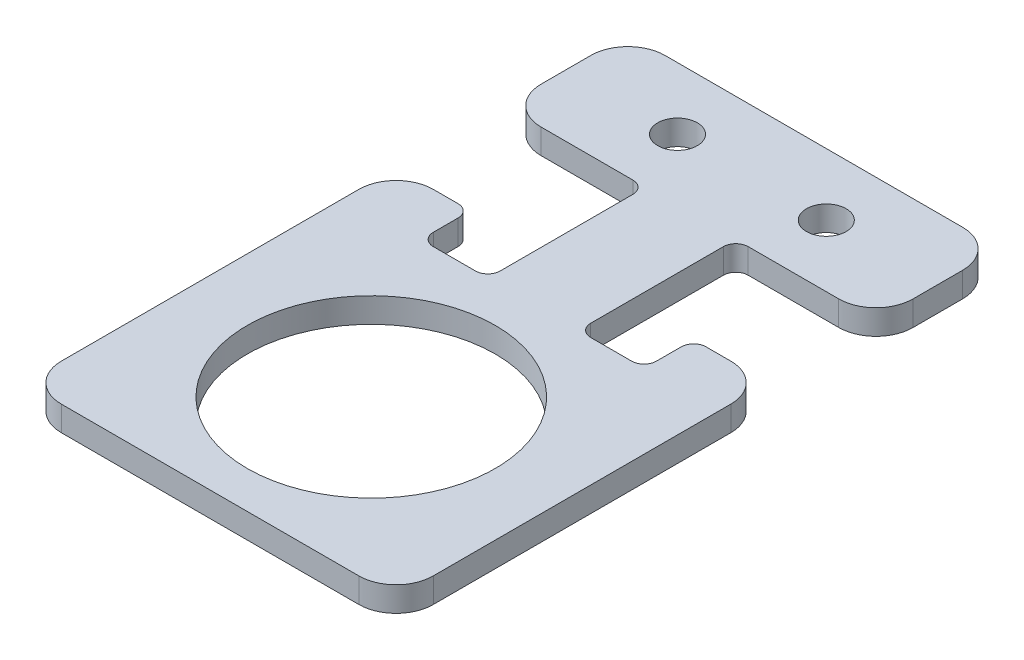
ISO-10303-21;
HEADER;
FILE_DESCRIPTION(('STEP AP214'),'2;1');
FILE_NAME('part.step','',(''),(''),'','','');
FILE_SCHEMA(('AUTOMOTIVE_DESIGN { 1 0 10303 214 1 1 1 1 }'));
ENDSEC;
DATA;
#1=APPLICATION_CONTEXT('core data for automotive mechanical design processes');
#2=APPLICATION_PROTOCOL_DEFINITION('international standard','automotive_design',2000,#1);
#3=PRODUCT_CONTEXT('',#1,'mechanical');
#4=PRODUCT('Part','Part','',(#3));
#5=PRODUCT_RELATED_PRODUCT_CATEGORY('part','',(#4));
#6=PRODUCT_DEFINITION_FORMATION('','',#4);
#7=PRODUCT_DEFINITION_CONTEXT('part definition',#1,'design');
#8=PRODUCT_DEFINITION('design','',#6,#7);
#9=PRODUCT_DEFINITION_SHAPE('','',#8);
#10=(LENGTH_UNIT() NAMED_UNIT(*) SI_UNIT(.MILLI.,.METRE.));
#11=(NAMED_UNIT(*) PLANE_ANGLE_UNIT() SI_UNIT($,.RADIAN.));
#12=(NAMED_UNIT(*) SI_UNIT($,.STERADIAN.) SOLID_ANGLE_UNIT());
#13=UNCERTAINTY_MEASURE_WITH_UNIT(LENGTH_MEASURE(1.E-05),#10,'distance_accuracy_value','');
#14=(GEOMETRIC_REPRESENTATION_CONTEXT(3) GLOBAL_UNCERTAINTY_ASSIGNED_CONTEXT((#13)) GLOBAL_UNIT_ASSIGNED_CONTEXT((#10,
#11,#12)) REPRESENTATION_CONTEXT('',''));
#15=CARTESIAN_POINT('',(0.,0.,0.));
#16=DIRECTION('',(0.,0.,1.));
#17=DIRECTION('',(1.,0.,0.));
#18=AXIS2_PLACEMENT_3D('',#15,#16,#17);
#19=CARTESIAN_POINT('',(15.,-2.,15.));
#20=DIRECTION('',(1.,0.,0.));
#21=DIRECTION('',(0.,0.,-1.));
#22=AXIS2_PLACEMENT_3D('',#19,#20,#21);
#23=PLANE('',#22);
#24=DIRECTION('',(0.,0.,-1.));
#25=VECTOR('',#24,1.);
#26=CARTESIAN_POINT('',(15.,-2.,15.));
#27=LINE('',#26,#25);
#28=CARTESIAN_POINT('',(15.,-2.,12.));
#29=VERTEX_POINT('',#28);
#30=CARTESIAN_POINT('',(15.,-2.,-12.));
#31=VERTEX_POINT('',#30);
#32=EDGE_CURVE('E446',#29,#31,#27,.T.);
#33=ORIENTED_EDGE('',*,*,#32,.T.);
#34=DIRECTION('',(0.,1.,0.));
#35=VECTOR('',#34,1.);
#36=CARTESIAN_POINT('',(15.,-2.,-12.));
#37=LINE('',#36,#35);
#38=CARTESIAN_POINT('',(15.,0.,-12.));
#39=VERTEX_POINT('',#38);
#40=EDGE_CURVE('E337',#31,#39,#37,.T.);
#41=ORIENTED_EDGE('',*,*,#40,.T.);
#42=DIRECTION('',(0.,0.,-1.));
#43=VECTOR('',#42,1.);
#44=CARTESIAN_POINT('',(15.,0.,15.));
#45=LINE('',#44,#43);
#46=CARTESIAN_POINT('',(15.,0.,12.));
#47=VERTEX_POINT('',#46);
#48=EDGE_CURVE('E478',#47,#39,#45,.T.);
#49=ORIENTED_EDGE('',*,*,#48,.F.);
#50=DIRECTION('',(0.,1.,0.));
#51=VECTOR('',#50,1.);
#52=CARTESIAN_POINT('',(15.,-2.,12.));
#53=LINE('',#52,#51);
#54=EDGE_CURVE('E335',#47,#29,#53,.F.);
#55=ORIENTED_EDGE('',*,*,#54,.T.);
#56=EDGE_LOOP('',(#33,#41,#49,#55));
#57=FACE_BOUND('',#56,.T.);
#58=ADVANCED_FACE('F46',(#57),#23,.T.);
#59=CARTESIAN_POINT('',(-15.,-2.,15.));
#60=DIRECTION('',(0.,0.,1.));
#61=DIRECTION('',(1.,0.,0.));
#62=AXIS2_PLACEMENT_3D('',#59,#60,#61);
#63=PLANE('',#62);
#64=DIRECTION('',(1.,0.,0.));
#65=VECTOR('',#64,1.);
#66=CARTESIAN_POINT('',(-15.,-2.,15.));
#67=LINE('',#66,#65);
#68=CARTESIAN_POINT('',(-12.,-2.,15.));
#69=VERTEX_POINT('',#68);
#70=CARTESIAN_POINT('',(12.,-2.,15.));
#71=VERTEX_POINT('',#70);
#72=EDGE_CURVE('E282',#69,#71,#67,.T.);
#73=ORIENTED_EDGE('',*,*,#72,.T.);
#74=DIRECTION('',(0.,1.,0.));
#75=VECTOR('',#74,1.);
#76=CARTESIAN_POINT('',(12.,-2.,15.));
#77=LINE('',#76,#75);
#78=CARTESIAN_POINT('',(12.,0.,15.));
#79=VERTEX_POINT('',#78);
#80=EDGE_CURVE('E344',#71,#79,#77,.T.);
#81=ORIENTED_EDGE('',*,*,#80,.T.);
#82=DIRECTION('',(1.,0.,0.));
#83=VECTOR('',#82,1.);
#84=CARTESIAN_POINT('',(-15.,0.,15.));
#85=LINE('',#84,#83);
#86=CARTESIAN_POINT('',(-12.,0.,15.));
#87=VERTEX_POINT('',#86);
#88=EDGE_CURVE('E290',#87,#79,#85,.T.);
#89=ORIENTED_EDGE('',*,*,#88,.F.);
#90=DIRECTION('',(0.,1.,0.));
#91=VECTOR('',#90,1.);
#92=CARTESIAN_POINT('',(-12.,-2.,15.));
#93=LINE('',#92,#91);
#94=EDGE_CURVE('E342',#87,#69,#93,.F.);
#95=ORIENTED_EDGE('',*,*,#94,.T.);
#96=EDGE_LOOP('',(#73,#81,#89,#95));
#97=FACE_BOUND('',#96,.T.);
#98=ADVANCED_FACE('F613',(#97),#63,.T.);
#99=CARTESIAN_POINT('',(-15.,-2.,15.));
#100=DIRECTION('',(-1.,0.,0.));
#101=DIRECTION('',(0.,0.,1.));
#102=AXIS2_PLACEMENT_3D('',#99,#100,#101);
#103=PLANE('',#102);
#104=DIRECTION('',(0.,0.,1.));
#105=VECTOR('',#104,1.);
#106=CARTESIAN_POINT('',(-15.,-2.,15.));
#107=LINE('',#106,#105);
#108=CARTESIAN_POINT('',(-15.,-2.,-12.));
#109=VERTEX_POINT('',#108);
#110=CARTESIAN_POINT('',(-15.,-2.,12.));
#111=VERTEX_POINT('',#110);
#112=EDGE_CURVE('E287',#109,#111,#107,.T.);
#113=ORIENTED_EDGE('',*,*,#112,.T.);
#114=DIRECTION('',(0.,1.,0.));
#115=VECTOR('',#114,1.);
#116=CARTESIAN_POINT('',(-15.,-2.,12.));
#117=LINE('',#116,#115);
#118=CARTESIAN_POINT('',(-15.,0.,12.));
#119=VERTEX_POINT('',#118);
#120=EDGE_CURVE('E349',#111,#119,#117,.T.);
#121=ORIENTED_EDGE('',*,*,#120,.T.);
#122=DIRECTION('',(0.,0.,1.));
#123=VECTOR('',#122,1.);
#124=CARTESIAN_POINT('',(-15.,0.,15.));
#125=LINE('',#124,#123);
#126=CARTESIAN_POINT('',(-15.,0.,-12.));
#127=VERTEX_POINT('',#126);
#128=EDGE_CURVE('E505',#127,#119,#125,.T.);
#129=ORIENTED_EDGE('',*,*,#128,.F.);
#130=DIRECTION('',(0.,1.,0.));
#131=VECTOR('',#130,1.);
#132=CARTESIAN_POINT('',(-15.,-2.,-12.));
#133=LINE('',#132,#131);
#134=EDGE_CURVE('E347',#127,#109,#133,.F.);
#135=ORIENTED_EDGE('',*,*,#134,.T.);
#136=EDGE_LOOP('',(#113,#121,#129,#135));
#137=FACE_BOUND('',#136,.T.);
#138=ADVANCED_FACE('F617',(#137),#103,.T.);
#139=CARTESIAN_POINT('',(-15.,-2.,-15.));
#140=DIRECTION('',(0.,0.,-1.));
#141=DIRECTION('',(-1.,0.,0.));
#142=AXIS2_PLACEMENT_3D('',#139,#140,#141);
#143=PLANE('',#142);
#144=DIRECTION('',(-1.,0.,0.));
#145=VECTOR('',#144,1.);
#146=CARTESIAN_POINT('',(-15.,0.,-15.));
#147=LINE('',#146,#145);
#148=CARTESIAN_POINT('',(-10.,0.,-15.));
#149=VERTEX_POINT('',#148);
#150=CARTESIAN_POINT('',(-12.,0.,-15.));
#151=VERTEX_POINT('',#150);
#152=EDGE_CURVE('E504',#149,#151,#147,.T.);
#153=ORIENTED_EDGE('',*,*,#152,.F.);
#154=DIRECTION('',(0.,1.,0.));
#155=VECTOR('',#154,1.);
#156=CARTESIAN_POINT('',(-10.,-2.,-15.));
#157=LINE('',#156,#155);
#158=CARTESIAN_POINT('',(-10.,-2.,-15.));
#159=VERTEX_POINT('',#158);
#160=EDGE_CURVE('E374',#149,#159,#157,.F.);
#161=ORIENTED_EDGE('',*,*,#160,.T.);
#162=DIRECTION('',(-1.,0.,0.));
#163=VECTOR('',#162,1.);
#164=CARTESIAN_POINT('',(-15.,-2.,-15.));
#165=LINE('',#164,#163);
#166=CARTESIAN_POINT('',(-12.,-2.,-15.));
#167=VERTEX_POINT('',#166);
#168=EDGE_CURVE('E474',#159,#167,#165,.T.);
#169=ORIENTED_EDGE('',*,*,#168,.T.);
#170=DIRECTION('',(0.,1.,0.));
#171=VECTOR('',#170,1.);
#172=CARTESIAN_POINT('',(-12.,-2.,-15.));
#173=LINE('',#172,#171);
#174=EDGE_CURVE('E352',#167,#151,#173,.T.);
#175=ORIENTED_EDGE('',*,*,#174,.T.);
#176=EDGE_LOOP('',(#153,#161,#169,#175));
#177=FACE_BOUND('',#176,.T.);
#178=ADVANCED_FACE('F654',(#177),#143,.T.);
#179=CARTESIAN_POINT('',(-9.,-2.,-15.));
#180=DIRECTION('',(1.,0.,0.));
#181=DIRECTION('',(0.,0.,-1.));
#182=AXIS2_PLACEMENT_3D('',#179,#180,#181);
#183=PLANE('',#182);
#184=DIRECTION('',(0.,0.,-1.));
#185=VECTOR('',#184,1.);
#186=CARTESIAN_POINT('',(-9.,0.,-15.));
#187=LINE('',#186,#185);
#188=CARTESIAN_POINT('',(-9.,0.,-12.));
#189=VERTEX_POINT('',#188);
#190=CARTESIAN_POINT('',(-9.,0.,-14.));
#191=VERTEX_POINT('',#190);
#192=EDGE_CURVE('E502',#189,#191,#187,.T.);
#193=ORIENTED_EDGE('',*,*,#192,.F.);
#194=DIRECTION('',(0.,1.,0.));
#195=VECTOR('',#194,1.);
#196=CARTESIAN_POINT('',(-9.,-2.,-12.));
#197=LINE('',#196,#195);
#198=CARTESIAN_POINT('',(-9.,-2.,-12.));
#199=VERTEX_POINT('',#198);
#200=EDGE_CURVE('E368',#189,#199,#197,.F.);
#201=ORIENTED_EDGE('',*,*,#200,.T.);
#202=DIRECTION('',(0.,0.,-1.));
#203=VECTOR('',#202,1.);
#204=CARTESIAN_POINT('',(-9.,-2.,-15.));
#205=LINE('',#204,#203);
#206=CARTESIAN_POINT('',(-9.,-2.,-14.));
#207=VERTEX_POINT('',#206);
#208=EDGE_CURVE('E471',#199,#207,#205,.T.);
#209=ORIENTED_EDGE('',*,*,#208,.T.);
#210=DIRECTION('',(0.,1.,0.));
#211=VECTOR('',#210,1.);
#212=CARTESIAN_POINT('',(-9.,-2.,-14.));
#213=LINE('',#212,#211);
#214=EDGE_CURVE('E365',#207,#191,#213,.T.);
#215=ORIENTED_EDGE('',*,*,#214,.T.);
#216=EDGE_LOOP('',(#193,#201,#209,#215));
#217=FACE_BOUND('',#216,.T.);
#218=ADVANCED_FACE('F568',(#217),#183,.T.);
#219=CARTESIAN_POINT('',(-9.,-2.,-11.));
#220=DIRECTION('',(0.,0.,-1.));
#221=DIRECTION('',(-1.,0.,0.));
#222=AXIS2_PLACEMENT_3D('',#219,#220,#221);
#223=PLANE('',#222);
#224=DIRECTION('',(-1.,0.,0.));
#225=VECTOR('',#224,1.);
#226=CARTESIAN_POINT('',(-9.,0.,-11.));
#227=LINE('',#226,#225);
#228=CARTESIAN_POINT('',(-4.6,0.,-11.));
#229=VERTEX_POINT('',#228);
#230=CARTESIAN_POINT('',(-8.,0.,-11.));
#231=VERTEX_POINT('',#230);
#232=EDGE_CURVE('E499',#229,#231,#227,.T.);
#233=ORIENTED_EDGE('',*,*,#232,.F.);
#234=DIRECTION('',(0.,1.,0.));
#235=VECTOR('',#234,1.);
#236=CARTESIAN_POINT('',(-4.6,-2.,-11.));
#237=LINE('',#236,#235);
#238=CARTESIAN_POINT('',(-4.6,-2.,-11.));
#239=VERTEX_POINT('',#238);
#240=EDGE_CURVE('E363',#229,#239,#237,.F.);
#241=ORIENTED_EDGE('',*,*,#240,.T.);
#242=DIRECTION('',(-1.,0.,0.));
#243=VECTOR('',#242,1.);
#244=CARTESIAN_POINT('',(-9.,-2.,-11.));
#245=LINE('',#244,#243);
#246=CARTESIAN_POINT('',(-8.,-2.,-11.));
#247=VERTEX_POINT('',#246);
#248=EDGE_CURVE('E468',#239,#247,#245,.T.);
#249=ORIENTED_EDGE('',*,*,#248,.T.);
#250=DIRECTION('',(0.,1.,0.));
#251=VECTOR('',#250,1.);
#252=CARTESIAN_POINT('',(-8.,0.,-11.));
#253=LINE('',#252,#251);
#254=EDGE_CURVE('E360',#247,#231,#253,.T.);
#255=ORIENTED_EDGE('',*,*,#254,.T.);
#256=EDGE_LOOP('',(#233,#241,#249,#255));
#257=FACE_BOUND('',#256,.T.);
#258=ADVANCED_FACE('F577',(#257),#223,.T.);
#259=CARTESIAN_POINT('',(-3.6,-2.,-11.));
#260=DIRECTION('',(-1.,0.,0.));
#261=DIRECTION('',(0.,0.,1.));
#262=AXIS2_PLACEMENT_3D('',#259,#260,#261);
#263=PLANE('',#262);
#264=DIRECTION('',(0.,0.,1.));
#265=VECTOR('',#264,1.);
#266=CARTESIAN_POINT('',(-3.6,-2.,-15.));
#267=LINE('',#266,#265);
#268=CARTESIAN_POINT('',(-3.6,-2.,-22.7));
#269=VERTEX_POINT('',#268);
#270=CARTESIAN_POINT('',(-3.6,-2.,-12.));
#271=VERTEX_POINT('',#270);
#272=EDGE_CURVE('E465',#269,#271,#267,.T.);
#273=ORIENTED_EDGE('',*,*,#272,.T.);
#274=DIRECTION('',(0.,1.,0.));
#275=VECTOR('',#274,1.);
#276=CARTESIAN_POINT('',(-3.6,0.,-12.));
#277=LINE('',#276,#275);
#278=CARTESIAN_POINT('',(-3.6,0.,-12.));
#279=VERTEX_POINT('',#278);
#280=EDGE_CURVE('E357',#271,#279,#277,.T.);
#281=ORIENTED_EDGE('',*,*,#280,.T.);
#282=DIRECTION('',(0.,0.,1.));
#283=VECTOR('',#282,1.);
#284=CARTESIAN_POINT('',(-3.6,0.,-11.));
#285=LINE('',#284,#283);
#286=CARTESIAN_POINT('',(-3.6,0.,-22.7));
#287=VERTEX_POINT('',#286);
#288=EDGE_CURVE('E496',#287,#279,#285,.T.);
#289=ORIENTED_EDGE('',*,*,#288,.F.);
#290=DIRECTION('',(0.,1.,0.));
#291=VECTOR('',#290,1.);
#292=CARTESIAN_POINT('',(-3.6,-2.,-22.7));
#293=LINE('',#292,#291);
#294=EDGE_CURVE('E355',#287,#269,#293,.F.);
#295=ORIENTED_EDGE('',*,*,#294,.T.);
#296=EDGE_LOOP('',(#273,#281,#289,#295));
#297=FACE_BOUND('',#296,.T.);
#298=ADVANCED_FACE('F587',(#297),#263,.T.);
#299=CARTESIAN_POINT('',(-3.6,-2.,-23.7));
#300=DIRECTION('',(0.,0.,1.));
#301=DIRECTION('',(1.,0.,0.));
#302=AXIS2_PLACEMENT_3D('',#299,#300,#301);
#303=PLANE('',#302);
#304=DIRECTION('',(1.,0.,0.));
#305=VECTOR('',#304,1.);
#306=CARTESIAN_POINT('',(-3.6,-2.,-23.7));
#307=LINE('',#306,#305);
#308=CARTESIAN_POINT('',(-12.,-2.,-23.7));
#309=VERTEX_POINT('',#308);
#310=CARTESIAN_POINT('',(-4.6,-2.,-23.7));
#311=VERTEX_POINT('',#310);
#312=EDGE_CURVE('E462',#309,#311,#307,.T.);
#313=ORIENTED_EDGE('',*,*,#312,.T.);
#314=DIRECTION('',(0.,1.,0.));
#315=VECTOR('',#314,1.);
#316=CARTESIAN_POINT('',(-4.6,0.,-23.7));
#317=LINE('',#316,#315);
#318=CARTESIAN_POINT('',(-4.6,0.,-23.7));
#319=VERTEX_POINT('',#318);
#320=EDGE_CURVE('E379',#311,#319,#317,.T.);
#321=ORIENTED_EDGE('',*,*,#320,.T.);
#322=DIRECTION('',(1.,0.,0.));
#323=VECTOR('',#322,1.);
#324=CARTESIAN_POINT('',(-3.6,0.,-23.7));
#325=LINE('',#324,#323);
#326=CARTESIAN_POINT('',(-12.,0.,-23.7));
#327=VERTEX_POINT('',#326);
#328=EDGE_CURVE('E277',#327,#319,#325,.T.);
#329=ORIENTED_EDGE('',*,*,#328,.F.);
#330=DIRECTION('',(0.,1.,0.));
#331=VECTOR('',#330,1.);
#332=CARTESIAN_POINT('',(-12.,-2.,-23.7));
#333=LINE('',#332,#331);
#334=EDGE_CURVE('E304',#327,#309,#333,.F.);
#335=ORIENTED_EDGE('',*,*,#334,.T.);
#336=EDGE_LOOP('',(#313,#321,#329,#335));
#337=FACE_BOUND('',#336,.T.);
#338=ADVANCED_FACE('F595',(#337),#303,.T.);
#339=CARTESIAN_POINT('',(-15.,-2.,-33.7));
#340=DIRECTION('',(-1.,0.,0.));
#341=DIRECTION('',(0.,0.,1.));
#342=AXIS2_PLACEMENT_3D('',#339,#340,#341);
#343=PLANE('',#342);
#344=DIRECTION('',(0.,0.,1.));
#345=VECTOR('',#344,1.);
#346=CARTESIAN_POINT('',(-15.,-2.,-33.7));
#347=LINE('',#346,#345);
#348=CARTESIAN_POINT('',(-15.,-2.,-30.7));
#349=VERTEX_POINT('',#348);
#350=CARTESIAN_POINT('',(-15.,-2.,-26.7));
#351=VERTEX_POINT('',#350);
#352=EDGE_CURVE('E460',#349,#351,#347,.T.);
#353=ORIENTED_EDGE('',*,*,#352,.T.);
#354=DIRECTION('',(0.,1.,0.));
#355=VECTOR('',#354,1.);
#356=CARTESIAN_POINT('',(-15.,-2.,-26.7));
#357=LINE('',#356,#355);
#358=CARTESIAN_POINT('',(-15.,0.,-26.7));
#359=VERTEX_POINT('',#358);
#360=EDGE_CURVE('E276',#351,#359,#357,.T.);
#361=ORIENTED_EDGE('',*,*,#360,.T.);
#362=DIRECTION('',(0.,0.,1.));
#363=VECTOR('',#362,1.);
#364=CARTESIAN_POINT('',(-15.,0.,-33.7));
#365=LINE('',#364,#363);
#366=CARTESIAN_POINT('',(-15.,0.,-30.7));
#367=VERTEX_POINT('',#366);
#368=EDGE_CURVE('E259',#367,#359,#365,.T.);
#369=ORIENTED_EDGE('',*,*,#368,.F.);
#370=DIRECTION('',(0.,1.,0.));
#371=VECTOR('',#370,1.);
#372=CARTESIAN_POINT('',(-15.,-2.,-30.7));
#373=LINE('',#372,#371);
#374=EDGE_CURVE('E273',#367,#349,#373,.F.);
#375=ORIENTED_EDGE('',*,*,#374,.T.);
#376=EDGE_LOOP('',(#353,#361,#369,#375));
#377=FACE_BOUND('',#376,.T.);
#378=ADVANCED_FACE('F272',(#377),#343,.T.);
#379=CARTESIAN_POINT('',(15.,-2.,-33.7));
#380=DIRECTION('',(0.,0.,-1.));
#381=DIRECTION('',(-1.,0.,0.));
#382=AXIS2_PLACEMENT_3D('',#379,#380,#381);
#383=PLANE('',#382);
#384=DIRECTION('',(-1.,0.,0.));
#385=VECTOR('',#384,1.);
#386=CARTESIAN_POINT('',(15.,-2.,-33.7));
#387=LINE('',#386,#385);
#388=CARTESIAN_POINT('',(12.,-2.,-33.7));
#389=VERTEX_POINT('',#388);
#390=CARTESIAN_POINT('',(-12.,-2.,-33.7));
#391=VERTEX_POINT('',#390);
#392=EDGE_CURVE('E457',#389,#391,#387,.T.);
#393=ORIENTED_EDGE('',*,*,#392,.T.);
#394=DIRECTION('',(0.,1.,0.));
#395=VECTOR('',#394,1.);
#396=CARTESIAN_POINT('',(-12.,-2.,-33.7));
#397=LINE('',#396,#395);
#398=CARTESIAN_POINT('',(-12.,0.,-33.7));
#399=VERTEX_POINT('',#398);
#400=EDGE_CURVE('E325',#391,#399,#397,.T.);
#401=ORIENTED_EDGE('',*,*,#400,.T.);
#402=DIRECTION('',(-1.,0.,0.));
#403=VECTOR('',#402,1.);
#404=CARTESIAN_POINT('',(15.,0.,-33.7));
#405=LINE('',#404,#403);
#406=CARTESIAN_POINT('',(12.,0.,-33.7));
#407=VERTEX_POINT('',#406);
#408=EDGE_CURVE('E261',#407,#399,#405,.T.);
#409=ORIENTED_EDGE('',*,*,#408,.F.);
#410=DIRECTION('',(0.,1.,0.));
#411=VECTOR('',#410,1.);
#412=CARTESIAN_POINT('',(12.,-2.,-33.7));
#413=LINE('',#412,#411);
#414=EDGE_CURVE('E323',#407,#389,#413,.F.);
#415=ORIENTED_EDGE('',*,*,#414,.T.);
#416=EDGE_LOOP('',(#393,#401,#409,#415));
#417=FACE_BOUND('',#416,.T.);
#418=ADVANCED_FACE('F639',(#417),#383,.T.);
#419=CARTESIAN_POINT('',(15.,-2.,-23.7));
#420=DIRECTION('',(1.,0.,0.));
#421=DIRECTION('',(0.,0.,-1.));
#422=AXIS2_PLACEMENT_3D('',#419,#420,#421);
#423=PLANE('',#422);
#424=DIRECTION('',(0.,0.,-1.));
#425=VECTOR('',#424,1.);
#426=CARTESIAN_POINT('',(15.,-2.,-23.7));
#427=LINE('',#426,#425);
#428=CARTESIAN_POINT('',(15.,-2.,-26.7));
#429=VERTEX_POINT('',#428);
#430=CARTESIAN_POINT('',(15.,-2.,-30.7));
#431=VERTEX_POINT('',#430);
#432=EDGE_CURVE('E454',#429,#431,#427,.T.);
#433=ORIENTED_EDGE('',*,*,#432,.T.);
#434=DIRECTION('',(0.,1.,0.));
#435=VECTOR('',#434,1.);
#436=CARTESIAN_POINT('',(15.,-2.,-30.7));
#437=LINE('',#436,#435);
#438=CARTESIAN_POINT('',(15.,0.,-30.7));
#439=VERTEX_POINT('',#438);
#440=EDGE_CURVE('E329',#431,#439,#437,.T.);
#441=ORIENTED_EDGE('',*,*,#440,.T.);
#442=DIRECTION('',(0.,0.,-1.));
#443=VECTOR('',#442,1.);
#444=CARTESIAN_POINT('',(15.,0.,-23.7));
#445=LINE('',#444,#443);
#446=CARTESIAN_POINT('',(15.,0.,-26.7));
#447=VERTEX_POINT('',#446);
#448=EDGE_CURVE('E490',#447,#439,#445,.T.);
#449=ORIENTED_EDGE('',*,*,#448,.F.);
#450=DIRECTION('',(0.,1.,0.));
#451=VECTOR('',#450,1.);
#452=CARTESIAN_POINT('',(15.,-2.,-26.7));
#453=LINE('',#452,#451);
#454=EDGE_CURVE('E327',#447,#429,#453,.F.);
#455=ORIENTED_EDGE('',*,*,#454,.T.);
#456=EDGE_LOOP('',(#433,#441,#449,#455));
#457=FACE_BOUND('',#456,.T.);
#458=ADVANCED_FACE('F635',(#457),#423,.T.);
#459=CARTESIAN_POINT('',(3.7,-2.,-23.7));
#460=DIRECTION('',(0.,0.,1.));
#461=DIRECTION('',(1.,0.,0.));
#462=AXIS2_PLACEMENT_3D('',#459,#460,#461);
#463=PLANE('',#462);
#464=DIRECTION('',(1.,0.,0.));
#465=VECTOR('',#464,1.);
#466=CARTESIAN_POINT('',(3.7,0.,-23.7));
#467=LINE('',#466,#465);
#468=CARTESIAN_POINT('',(4.7,0.,-23.7));
#469=VERTEX_POINT('',#468);
#470=CARTESIAN_POINT('',(12.,0.,-23.7));
#471=VERTEX_POINT('',#470);
#472=EDGE_CURVE('E488',#469,#471,#467,.T.);
#473=ORIENTED_EDGE('',*,*,#472,.F.);
#474=DIRECTION('',(0.,1.,0.));
#475=VECTOR('',#474,1.);
#476=CARTESIAN_POINT('',(4.7,-2.,-23.7));
#477=LINE('',#476,#475);
#478=CARTESIAN_POINT('',(4.7,-2.,-23.7));
#479=VERTEX_POINT('',#478);
#480=EDGE_CURVE('E387',#469,#479,#477,.F.);
#481=ORIENTED_EDGE('',*,*,#480,.T.);
#482=DIRECTION('',(1.,0.,0.));
#483=VECTOR('',#482,1.);
#484=CARTESIAN_POINT('',(3.7,-2.,-23.7));
#485=LINE('',#484,#483);
#486=CARTESIAN_POINT('',(12.,-2.,-23.7));
#487=VERTEX_POINT('',#486);
#488=EDGE_CURVE('E452',#479,#487,#485,.T.);
#489=ORIENTED_EDGE('',*,*,#488,.T.);
#490=DIRECTION('',(0.,1.,0.));
#491=VECTOR('',#490,1.);
#492=CARTESIAN_POINT('',(12.,-2.,-23.7));
#493=LINE('',#492,#491);
#494=EDGE_CURVE('E332',#487,#471,#493,.T.);
#495=ORIENTED_EDGE('',*,*,#494,.T.);
#496=EDGE_LOOP('',(#473,#481,#489,#495));
#497=FACE_BOUND('',#496,.T.);
#498=ADVANCED_FACE('F631',(#497),#463,.T.);
#499=CARTESIAN_POINT('',(3.7,-2.,-15.));
#500=DIRECTION('',(1.,0.,0.));
#501=DIRECTION('',(0.,0.,-1.));
#502=AXIS2_PLACEMENT_3D('',#499,#500,#501);
#503=PLANE('',#502);
#504=DIRECTION('',(0.,0.,-1.));
#505=VECTOR('',#504,1.);
#506=CARTESIAN_POINT('',(3.7,-2.,-11.));
#507=LINE('',#506,#505);
#508=CARTESIAN_POINT('',(3.7,-2.,-12.));
#509=VERTEX_POINT('',#508);
#510=CARTESIAN_POINT('',(3.7,-2.,-22.7));
#511=VERTEX_POINT('',#510);
#512=EDGE_CURVE('E444',#509,#511,#507,.T.);
#513=ORIENTED_EDGE('',*,*,#512,.T.);
#514=DIRECTION('',(0.,1.,0.));
#515=VECTOR('',#514,1.);
#516=CARTESIAN_POINT('',(3.7,0.,-22.7));
#517=LINE('',#516,#515);
#518=CARTESIAN_POINT('',(3.7,0.,-22.7));
#519=VERTEX_POINT('',#518);
#520=EDGE_CURVE('E384',#511,#519,#517,.T.);
#521=ORIENTED_EDGE('',*,*,#520,.T.);
#522=DIRECTION('',(0.,0.,-1.));
#523=VECTOR('',#522,1.);
#524=CARTESIAN_POINT('',(3.7,0.,-15.));
#525=LINE('',#524,#523);
#526=CARTESIAN_POINT('',(3.7,0.,-12.));
#527=VERTEX_POINT('',#526);
#528=EDGE_CURVE('E434',#527,#519,#525,.T.);
#529=ORIENTED_EDGE('',*,*,#528,.F.);
#530=DIRECTION('',(0.,1.,0.));
#531=VECTOR('',#530,1.);
#532=CARTESIAN_POINT('',(3.7,-2.,-12.));
#533=LINE('',#532,#531);
#534=EDGE_CURVE('E382',#527,#509,#533,.F.);
#535=ORIENTED_EDGE('',*,*,#534,.T.);
#536=EDGE_LOOP('',(#513,#521,#529,#535));
#537=FACE_BOUND('',#536,.T.);
#538=ADVANCED_FACE('F628',(#537),#503,.T.);
#539=CARTESIAN_POINT('',(9.,-2.,-11.));
#540=DIRECTION('',(0.,0.,-1.));
#541=DIRECTION('',(-1.,0.,0.));
#542=AXIS2_PLACEMENT_3D('',#539,#540,#541);
#543=PLANE('',#542);
#544=DIRECTION('',(-1.,0.,0.));
#545=VECTOR('',#544,1.);
#546=CARTESIAN_POINT('',(9.,-2.,-11.));
#547=LINE('',#546,#545);
#548=CARTESIAN_POINT('',(8.,-2.,-11.));
#549=VERTEX_POINT('',#548);
#550=CARTESIAN_POINT('',(4.7,-2.,-11.));
#551=VERTEX_POINT('',#550);
#552=EDGE_CURVE('E441',#549,#551,#547,.T.);
#553=ORIENTED_EDGE('',*,*,#552,.T.);
#554=DIRECTION('',(0.,1.,0.));
#555=VECTOR('',#554,1.);
#556=CARTESIAN_POINT('',(4.7,0.,-11.));
#557=LINE('',#556,#555);
#558=CARTESIAN_POINT('',(4.7,0.,-11.));
#559=VERTEX_POINT('',#558);
#560=EDGE_CURVE('E391',#551,#559,#557,.T.);
#561=ORIENTED_EDGE('',*,*,#560,.T.);
#562=DIRECTION('',(-1.,0.,0.));
#563=VECTOR('',#562,1.);
#564=CARTESIAN_POINT('',(9.,0.,-11.));
#565=LINE('',#564,#563);
#566=CARTESIAN_POINT('',(8.,0.,-11.));
#567=VERTEX_POINT('',#566);
#568=EDGE_CURVE('E424',#567,#559,#565,.T.);
#569=ORIENTED_EDGE('',*,*,#568,.F.);
#570=DIRECTION('',(0.,1.,0.));
#571=VECTOR('',#570,1.);
#572=CARTESIAN_POINT('',(8.,-2.,-11.));
#573=LINE('',#572,#571);
#574=EDGE_CURVE('E389',#567,#549,#573,.F.);
#575=ORIENTED_EDGE('',*,*,#574,.T.);
#576=EDGE_LOOP('',(#553,#561,#569,#575));
#577=FACE_BOUND('',#576,.T.);
#578=ADVANCED_FACE('F432',(#577),#543,.T.);
#579=CARTESIAN_POINT('',(9.,-2.,-15.));
#580=DIRECTION('',(-1.,0.,0.));
#581=DIRECTION('',(0.,0.,1.));
#582=AXIS2_PLACEMENT_3D('',#579,#580,#581);
#583=PLANE('',#582);
#584=DIRECTION('',(0.,0.,1.));
#585=VECTOR('',#584,1.);
#586=CARTESIAN_POINT('',(9.,-2.,-15.));
#587=LINE('',#586,#585);
#588=CARTESIAN_POINT('',(9.,-2.,-14.));
#589=VERTEX_POINT('',#588);
#590=CARTESIAN_POINT('',(9.,-2.,-12.));
#591=VERTEX_POINT('',#590);
#592=EDGE_CURVE('E440',#589,#591,#587,.T.);
#593=ORIENTED_EDGE('',*,*,#592,.T.);
#594=DIRECTION('',(0.,1.,0.));
#595=VECTOR('',#594,1.);
#596=CARTESIAN_POINT('',(9.,0.,-12.));
#597=LINE('',#596,#595);
#598=CARTESIAN_POINT('',(9.,0.,-12.));
#599=VERTEX_POINT('',#598);
#600=EDGE_CURVE('E396',#591,#599,#597,.T.);
#601=ORIENTED_EDGE('',*,*,#600,.T.);
#602=DIRECTION('',(0.,0.,1.));
#603=VECTOR('',#602,1.);
#604=CARTESIAN_POINT('',(9.,0.,-15.));
#605=LINE('',#604,#603);
#606=CARTESIAN_POINT('',(9.,0.,-14.));
#607=VERTEX_POINT('',#606);
#608=EDGE_CURVE('E426',#607,#599,#605,.T.);
#609=ORIENTED_EDGE('',*,*,#608,.F.);
#610=DIRECTION('',(0.,1.,0.));
#611=VECTOR('',#610,1.);
#612=CARTESIAN_POINT('',(9.,-2.,-14.));
#613=LINE('',#612,#611);
#614=EDGE_CURVE('E394',#607,#589,#613,.F.);
#615=ORIENTED_EDGE('',*,*,#614,.T.);
#616=EDGE_LOOP('',(#593,#601,#609,#615));
#617=FACE_BOUND('',#616,.T.);
#618=ADVANCED_FACE('F438',(#617),#583,.T.);
#619=CARTESIAN_POINT('',(15.,-2.,-15.));
#620=DIRECTION('',(0.,0.,-1.));
#621=DIRECTION('',(-1.,0.,0.));
#622=AXIS2_PLACEMENT_3D('',#619,#620,#621);
#623=PLANE('',#622);
#624=DIRECTION('',(-1.,0.,0.));
#625=VECTOR('',#624,1.);
#626=CARTESIAN_POINT('',(15.,-2.,-15.));
#627=LINE('',#626,#625);
#628=CARTESIAN_POINT('',(12.,-2.,-15.));
#629=VERTEX_POINT('',#628);
#630=CARTESIAN_POINT('',(10.,-2.,-15.));
#631=VERTEX_POINT('',#630);
#632=EDGE_CURVE('E442',#629,#631,#627,.T.);
#633=ORIENTED_EDGE('',*,*,#632,.T.);
#634=DIRECTION('',(0.,1.,0.));
#635=VECTOR('',#634,1.);
#636=CARTESIAN_POINT('',(10.,-2.,-15.));
#637=LINE('',#636,#635);
#638=CARTESIAN_POINT('',(10.,0.,-15.));
#639=VERTEX_POINT('',#638);
#640=EDGE_CURVE('E399',#631,#639,#637,.T.);
#641=ORIENTED_EDGE('',*,*,#640,.T.);
#642=DIRECTION('',(-1.,0.,0.));
#643=VECTOR('',#642,1.);
#644=CARTESIAN_POINT('',(15.,0.,-15.));
#645=LINE('',#644,#643);
#646=CARTESIAN_POINT('',(12.,0.,-15.));
#647=VERTEX_POINT('',#646);
#648=EDGE_CURVE('E481',#647,#639,#645,.T.);
#649=ORIENTED_EDGE('',*,*,#648,.F.);
#650=DIRECTION('',(0.,1.,0.));
#651=VECTOR('',#650,1.);
#652=CARTESIAN_POINT('',(12.,-2.,-15.));
#653=LINE('',#652,#651);
#654=EDGE_CURVE('E340',#647,#629,#653,.F.);
#655=ORIENTED_EDGE('',*,*,#654,.T.);
#656=EDGE_LOOP('',(#633,#641,#649,#655));
#657=FACE_BOUND('',#656,.T.);
#658=ADVANCED_FACE('F552',(#657),#623,.T.);
#659=CARTESIAN_POINT('',(0.,-2.,0.));
#660=DIRECTION('',(0.,1.,0.));
#661=DIRECTION('',(0.,0.,1.));
#662=AXIS2_PLACEMENT_3D('',#659,#660,#661);
#663=PLANE('',#662);
#664=CARTESIAN_POINT('',(0.,-2.,2.));
#665=DIRECTION('',(0.,1.,0.));
#666=DIRECTION('',(0.,0.,1.));
#667=AXIS2_PLACEMENT_3D('',#664,#665,#666);
#668=CIRCLE('',#667,10.);
#669=CARTESIAN_POINT('',(0.,-2.,12.));
#670=VERTEX_POINT('',#669);
#671=EDGE_CURVE('E524',#670,#670,#668,.T.);
#672=ORIENTED_EDGE('',*,*,#671,.T.);
#673=EDGE_LOOP('',(#672));
#674=FACE_BOUND('',#673,.T.);
#675=CARTESIAN_POINT('',(-6.,-2.,-28.7));
#676=DIRECTION('',(0.,1.,0.));
#677=DIRECTION('',(0.,0.,1.));
#678=AXIS2_PLACEMENT_3D('',#675,#676,#677);
#679=CIRCLE('',#678,1.6);
#680=CARTESIAN_POINT('',(-6.,-2.,-27.1));
#681=VERTEX_POINT('',#680);
#682=EDGE_CURVE('E482',#681,#681,#679,.T.);
#683=ORIENTED_EDGE('',*,*,#682,.T.);
#684=EDGE_LOOP('',(#683));
#685=FACE_BOUND('',#684,.T.);
#686=CARTESIAN_POINT('',(6.,-2.,-28.7));
#687=DIRECTION('',(0.,1.,0.));
#688=DIRECTION('',(0.,0.,1.));
#689=AXIS2_PLACEMENT_3D('',#686,#687,#688);
#690=CIRCLE('',#689,1.6);
#691=CARTESIAN_POINT('',(6.,-2.,-27.1));
#692=VERTEX_POINT('',#691);
#693=EDGE_CURVE('E517',#692,#692,#690,.T.);
#694=ORIENTED_EDGE('',*,*,#693,.T.);
#695=EDGE_LOOP('',(#694));
#696=FACE_BOUND('',#695,.T.);
#697=ORIENTED_EDGE('',*,*,#168,.F.);
#698=CARTESIAN_POINT('',(-10.,-2.,-14.));
#699=DIRECTION('',(0.,1.,0.));
#700=DIRECTION('',(0.,0.,1.));
#701=AXIS2_PLACEMENT_3D('',#698,#699,#700);
#702=CIRCLE('',#701,1.);
#703=EDGE_CURVE('E377',#159,#207,#702,.F.);
#704=ORIENTED_EDGE('',*,*,#703,.T.);
#705=ORIENTED_EDGE('',*,*,#208,.F.);
#706=CARTESIAN_POINT('',(-8.,-2.,-12.));
#707=DIRECTION('',(0.,1.,0.));
#708=DIRECTION('',(0.,0.,1.));
#709=AXIS2_PLACEMENT_3D('',#706,#707,#708);
#710=CIRCLE('',#709,1.);
#711=EDGE_CURVE('E408',#199,#247,#710,.T.);
#712=ORIENTED_EDGE('',*,*,#711,.T.);
#713=ORIENTED_EDGE('',*,*,#248,.F.);
#714=CARTESIAN_POINT('',(-4.6,-2.,-12.));
#715=DIRECTION('',(0.,1.,0.));
#716=DIRECTION('',(0.,0.,1.));
#717=AXIS2_PLACEMENT_3D('',#714,#715,#716);
#718=CIRCLE('',#717,1.);
#719=EDGE_CURVE('E404',#239,#271,#718,.T.);
#720=ORIENTED_EDGE('',*,*,#719,.T.);
#721=ORIENTED_EDGE('',*,*,#272,.F.);
#722=CARTESIAN_POINT('',(-4.6,-2.,-22.7));
#723=DIRECTION('',(0.,1.,0.));
#724=DIRECTION('',(0.,0.,1.));
#725=AXIS2_PLACEMENT_3D('',#722,#723,#724);
#726=CIRCLE('',#725,1.);
#727=EDGE_CURVE('E412',#269,#311,#726,.T.);
#728=ORIENTED_EDGE('',*,*,#727,.T.);
#729=ORIENTED_EDGE('',*,*,#312,.F.);
#730=CARTESIAN_POINT('',(-12.,-2.,-26.7));
#731=DIRECTION('',(0.,1.,0.));
#732=DIRECTION('',(0.,0.,1.));
#733=AXIS2_PLACEMENT_3D('',#730,#731,#732);
#734=CIRCLE('',#733,3.);
#735=EDGE_CURVE('E321',#309,#351,#734,.F.);
#736=ORIENTED_EDGE('',*,*,#735,.T.);
#737=ORIENTED_EDGE('',*,*,#352,.F.);
#738=CARTESIAN_POINT('',(-12.,-2.,-30.7));
#739=DIRECTION('',(0.,1.,0.));
#740=DIRECTION('',(0.,0.,1.));
#741=AXIS2_PLACEMENT_3D('',#738,#739,#740);
#742=CIRCLE('',#741,3.);
#743=EDGE_CURVE('E281',#349,#391,#742,.F.);
#744=ORIENTED_EDGE('',*,*,#743,.T.);
#745=ORIENTED_EDGE('',*,*,#392,.F.);
#746=CARTESIAN_POINT('',(12.,-2.,-30.7));
#747=DIRECTION('',(0.,1.,0.));
#748=DIRECTION('',(0.,0.,1.));
#749=AXIS2_PLACEMENT_3D('',#746,#747,#748);
#750=CIRCLE('',#749,3.);
#751=EDGE_CURVE('E318',#389,#431,#750,.F.);
#752=ORIENTED_EDGE('',*,*,#751,.T.);
#753=ORIENTED_EDGE('',*,*,#432,.F.);
#754=CARTESIAN_POINT('',(12.,-2.,-26.7));
#755=DIRECTION('',(0.,1.,0.));
#756=DIRECTION('',(0.,0.,1.));
#757=AXIS2_PLACEMENT_3D('',#754,#755,#756);
#758=CIRCLE('',#757,3.);
#759=EDGE_CURVE('E315',#429,#487,#758,.F.);
#760=ORIENTED_EDGE('',*,*,#759,.T.);
#761=ORIENTED_EDGE('',*,*,#488,.F.);
#762=CARTESIAN_POINT('',(4.7,-2.,-22.7));
#763=DIRECTION('',(0.,1.,0.));
#764=DIRECTION('',(0.,0.,1.));
#765=AXIS2_PLACEMENT_3D('',#762,#763,#764);
#766=CIRCLE('',#765,1.);
#767=EDGE_CURVE('E416',#479,#511,#766,.T.);
#768=ORIENTED_EDGE('',*,*,#767,.T.);
#769=ORIENTED_EDGE('',*,*,#512,.F.);
#770=CARTESIAN_POINT('',(4.7,-2.,-12.));
#771=DIRECTION('',(0.,1.,0.));
#772=DIRECTION('',(0.,0.,1.));
#773=AXIS2_PLACEMENT_3D('',#770,#771,#772);
#774=CIRCLE('',#773,1.);
#775=EDGE_CURVE('E420',#509,#551,#774,.T.);
#776=ORIENTED_EDGE('',*,*,#775,.T.);
#777=ORIENTED_EDGE('',*,*,#552,.F.);
#778=CARTESIAN_POINT('',(8.,-2.,-12.));
#779=DIRECTION('',(0.,1.,0.));
#780=DIRECTION('',(0.,0.,1.));
#781=AXIS2_PLACEMENT_3D('',#778,#779,#780);
#782=CIRCLE('',#781,1.);
#783=EDGE_CURVE('E12',#549,#591,#782,.T.);
#784=ORIENTED_EDGE('',*,*,#783,.T.);
#785=ORIENTED_EDGE('',*,*,#592,.F.);
#786=CARTESIAN_POINT('',(10.,-2.,-14.));
#787=DIRECTION('',(0.,1.,0.));
#788=DIRECTION('',(0.,0.,1.));
#789=AXIS2_PLACEMENT_3D('',#786,#787,#788);
#790=CIRCLE('',#789,1.);
#791=EDGE_CURVE('E61',#589,#631,#790,.F.);
#792=ORIENTED_EDGE('',*,*,#791,.T.);
#793=ORIENTED_EDGE('',*,*,#632,.F.);
#794=CARTESIAN_POINT('',(12.,-2.,-12.));
#795=DIRECTION('',(0.,1.,0.));
#796=DIRECTION('',(0.,0.,1.));
#797=AXIS2_PLACEMENT_3D('',#794,#795,#796);
#798=CIRCLE('',#797,3.);
#799=EDGE_CURVE('E313',#629,#31,#798,.F.);
#800=ORIENTED_EDGE('',*,*,#799,.T.);
#801=ORIENTED_EDGE('',*,*,#32,.F.);
#802=CARTESIAN_POINT('',(12.,-2.,12.));
#803=DIRECTION('',(0.,1.,0.));
#804=DIRECTION('',(0.,0.,1.));
#805=AXIS2_PLACEMENT_3D('',#802,#803,#804);
#806=CIRCLE('',#805,3.);
#807=EDGE_CURVE('E311',#29,#71,#806,.F.);
#808=ORIENTED_EDGE('',*,*,#807,.T.);
#809=ORIENTED_EDGE('',*,*,#72,.F.);
#810=CARTESIAN_POINT('',(-12.,-2.,12.));
#811=DIRECTION('',(0.,1.,0.));
#812=DIRECTION('',(0.,0.,1.));
#813=AXIS2_PLACEMENT_3D('',#810,#811,#812);
#814=CIRCLE('',#813,3.);
#815=EDGE_CURVE('E309',#69,#111,#814,.F.);
#816=ORIENTED_EDGE('',*,*,#815,.T.);
#817=ORIENTED_EDGE('',*,*,#112,.F.);
#818=CARTESIAN_POINT('',(-12.,-2.,-12.));
#819=DIRECTION('',(0.,1.,0.));
#820=DIRECTION('',(0.,0.,1.));
#821=AXIS2_PLACEMENT_3D('',#818,#819,#820);
#822=CIRCLE('',#821,3.);
#823=EDGE_CURVE('E306',#109,#167,#822,.F.);
#824=ORIENTED_EDGE('',*,*,#823,.T.);
#825=EDGE_LOOP('',(#697,#704,#705,#712,#713,#720,#721,#728,#729,#736,#737,#744,#745,#752,#753,
#760,#761,#768,#769,#776,#777,#784,#785,#792,#793,#800,#801,#808,#809,#816,#817,#824));
#826=FACE_BOUND('',#825,.T.);
#827=ADVANCED_FACE('F539',(#674,#685,#696,#826),#663,.F.);
#828=CARTESIAN_POINT('',(0.,0.,0.));
#829=DIRECTION('',(0.,1.,0.));
#830=DIRECTION('',(0.,0.,1.));
#831=AXIS2_PLACEMENT_3D('',#828,#829,#830);
#832=PLANE('',#831);
#833=CARTESIAN_POINT('',(0.,0.,2.));
#834=DIRECTION('',(0.,1.,0.));
#835=DIRECTION('',(0.,0.,1.));
#836=AXIS2_PLACEMENT_3D('',#833,#834,#835);
#837=CIRCLE('',#836,10.);
#838=CARTESIAN_POINT('',(0.,0.,12.));
#839=VERTEX_POINT('',#838);
#840=EDGE_CURVE('E529',#839,#839,#837,.T.);
#841=ORIENTED_EDGE('',*,*,#840,.F.);
#842=EDGE_LOOP('',(#841));
#843=FACE_BOUND('',#842,.T.);
#844=CARTESIAN_POINT('',(-6.,0.,-28.7));
#845=DIRECTION('',(0.,1.,0.));
#846=DIRECTION('',(0.,0.,1.));
#847=AXIS2_PLACEMENT_3D('',#844,#845,#846);
#848=CIRCLE('',#847,1.6);
#849=CARTESIAN_POINT('',(-6.,0.,-27.1));
#850=VERTEX_POINT('',#849);
#851=EDGE_CURVE('E520',#850,#850,#848,.T.);
#852=ORIENTED_EDGE('',*,*,#851,.F.);
#853=EDGE_LOOP('',(#852));
#854=FACE_BOUND('',#853,.T.);
#855=CARTESIAN_POINT('',(6.,0.,-28.7));
#856=DIRECTION('',(0.,1.,0.));
#857=DIRECTION('',(0.,0.,1.));
#858=AXIS2_PLACEMENT_3D('',#855,#856,#857);
#859=CIRCLE('',#858,1.6);
#860=CARTESIAN_POINT('',(6.,0.,-27.1));
#861=VERTEX_POINT('',#860);
#862=EDGE_CURVE('E521',#861,#861,#859,.T.);
#863=ORIENTED_EDGE('',*,*,#862,.F.);
#864=EDGE_LOOP('',(#863));
#865=FACE_BOUND('',#864,.T.);
#866=ORIENTED_EDGE('',*,*,#192,.T.);
#867=CARTESIAN_POINT('',(-10.,0.,-14.));
#868=DIRECTION('',(0.,1.,0.));
#869=DIRECTION('',(0.,0.,1.));
#870=AXIS2_PLACEMENT_3D('',#867,#868,#869);
#871=CIRCLE('',#870,1.);
#872=EDGE_CURVE('E372',#191,#149,#871,.T.);
#873=ORIENTED_EDGE('',*,*,#872,.T.);
#874=ORIENTED_EDGE('',*,*,#152,.T.);
#875=CARTESIAN_POINT('',(-12.,0.,-12.));
#876=DIRECTION('',(0.,1.,0.));
#877=DIRECTION('',(0.,0.,1.));
#878=AXIS2_PLACEMENT_3D('',#875,#876,#877);
#879=CIRCLE('',#878,3.);
#880=EDGE_CURVE('E284',#151,#127,#879,.T.);
#881=ORIENTED_EDGE('',*,*,#880,.T.);
#882=ORIENTED_EDGE('',*,*,#128,.T.);
#883=CARTESIAN_POINT('',(-12.,0.,12.));
#884=DIRECTION('',(0.,1.,0.));
#885=DIRECTION('',(0.,0.,1.));
#886=AXIS2_PLACEMENT_3D('',#883,#884,#885);
#887=CIRCLE('',#886,3.);
#888=EDGE_CURVE('E294',#119,#87,#887,.T.);
#889=ORIENTED_EDGE('',*,*,#888,.T.);
#890=ORIENTED_EDGE('',*,*,#88,.T.);
#891=CARTESIAN_POINT('',(12.,0.,12.));
#892=DIRECTION('',(0.,1.,0.));
#893=DIRECTION('',(0.,0.,1.));
#894=AXIS2_PLACEMENT_3D('',#891,#892,#893);
#895=CIRCLE('',#894,3.);
#896=EDGE_CURVE('E296',#79,#47,#895,.T.);
#897=ORIENTED_EDGE('',*,*,#896,.T.);
#898=ORIENTED_EDGE('',*,*,#48,.T.);
#899=CARTESIAN_POINT('',(12.,0.,-12.));
#900=DIRECTION('',(0.,1.,0.));
#901=DIRECTION('',(0.,0.,1.));
#902=AXIS2_PLACEMENT_3D('',#899,#900,#901);
#903=CIRCLE('',#902,3.);
#904=EDGE_CURVE('E298',#39,#647,#903,.T.);
#905=ORIENTED_EDGE('',*,*,#904,.T.);
#906=ORIENTED_EDGE('',*,*,#648,.T.);
#907=CARTESIAN_POINT('',(10.,0.,-14.));
#908=DIRECTION('',(0.,1.,0.));
#909=DIRECTION('',(0.,0.,1.));
#910=AXIS2_PLACEMENT_3D('',#907,#908,#909);
#911=CIRCLE('',#910,1.);
#912=EDGE_CURVE('E370',#639,#607,#911,.T.);
#913=ORIENTED_EDGE('',*,*,#912,.T.);
#914=ORIENTED_EDGE('',*,*,#608,.T.);
#915=CARTESIAN_POINT('',(8.,0.,-12.));
#916=DIRECTION('',(0.,1.,0.));
#917=DIRECTION('',(0.,0.,1.));
#918=AXIS2_PLACEMENT_3D('',#915,#916,#917);
#919=CIRCLE('',#918,1.);
#920=EDGE_CURVE('E54',#599,#567,#919,.F.);
#921=ORIENTED_EDGE('',*,*,#920,.T.);
#922=ORIENTED_EDGE('',*,*,#568,.T.);
#923=CARTESIAN_POINT('',(4.7,0.,-12.));
#924=DIRECTION('',(0.,1.,0.));
#925=DIRECTION('',(0.,0.,1.));
#926=AXIS2_PLACEMENT_3D('',#923,#924,#925);
#927=CIRCLE('',#926,1.);
#928=EDGE_CURVE('E418',#559,#527,#927,.F.);
#929=ORIENTED_EDGE('',*,*,#928,.T.);
#930=ORIENTED_EDGE('',*,*,#528,.T.);
#931=CARTESIAN_POINT('',(4.7,0.,-22.7));
#932=DIRECTION('',(0.,1.,0.));
#933=DIRECTION('',(0.,0.,1.));
#934=AXIS2_PLACEMENT_3D('',#931,#932,#933);
#935=CIRCLE('',#934,1.);
#936=EDGE_CURVE('E414',#519,#469,#935,.F.);
#937=ORIENTED_EDGE('',*,*,#936,.T.);
#938=ORIENTED_EDGE('',*,*,#472,.T.);
#939=CARTESIAN_POINT('',(12.,0.,-26.7));
#940=DIRECTION('',(0.,1.,0.));
#941=DIRECTION('',(0.,0.,1.));
#942=AXIS2_PLACEMENT_3D('',#939,#940,#941);
#943=CIRCLE('',#942,3.);
#944=EDGE_CURVE('E300',#471,#447,#943,.T.);
#945=ORIENTED_EDGE('',*,*,#944,.T.);
#946=ORIENTED_EDGE('',*,*,#448,.T.);
#947=CARTESIAN_POINT('',(12.,0.,-30.7));
#948=DIRECTION('',(0.,1.,0.));
#949=DIRECTION('',(0.,0.,1.));
#950=AXIS2_PLACEMENT_3D('',#947,#948,#949);
#951=CIRCLE('',#950,3.);
#952=EDGE_CURVE('E267',#439,#407,#951,.T.);
#953=ORIENTED_EDGE('',*,*,#952,.T.);
#954=ORIENTED_EDGE('',*,*,#408,.T.);
#955=CARTESIAN_POINT('',(-12.,0.,-30.7));
#956=DIRECTION('',(0.,1.,0.));
#957=DIRECTION('',(0.,0.,1.));
#958=AXIS2_PLACEMENT_3D('',#955,#956,#957);
#959=CIRCLE('',#958,3.);
#960=EDGE_CURVE('E255',#399,#367,#959,.T.);
#961=ORIENTED_EDGE('',*,*,#960,.T.);
#962=ORIENTED_EDGE('',*,*,#368,.T.);
#963=CARTESIAN_POINT('',(-12.,0.,-26.7));
#964=DIRECTION('',(0.,1.,0.));
#965=DIRECTION('',(0.,0.,1.));
#966=AXIS2_PLACEMENT_3D('',#963,#964,#965);
#967=CIRCLE('',#966,3.);
#968=EDGE_CURVE('E266',#359,#327,#967,.T.);
#969=ORIENTED_EDGE('',*,*,#968,.T.);
#970=ORIENTED_EDGE('',*,*,#328,.T.);
#971=CARTESIAN_POINT('',(-4.6,0.,-22.7));
#972=DIRECTION('',(0.,1.,0.));
#973=DIRECTION('',(0.,0.,1.));
#974=AXIS2_PLACEMENT_3D('',#971,#972,#973);
#975=CIRCLE('',#974,1.);
#976=EDGE_CURVE('E410',#319,#287,#975,.F.);
#977=ORIENTED_EDGE('',*,*,#976,.T.);
#978=ORIENTED_EDGE('',*,*,#288,.T.);
#979=CARTESIAN_POINT('',(-4.6,0.,-12.));
#980=DIRECTION('',(0.,1.,0.));
#981=DIRECTION('',(0.,0.,1.));
#982=AXIS2_PLACEMENT_3D('',#979,#980,#981);
#983=CIRCLE('',#982,1.);
#984=EDGE_CURVE('E402',#279,#229,#983,.F.);
#985=ORIENTED_EDGE('',*,*,#984,.T.);
#986=ORIENTED_EDGE('',*,*,#232,.T.);
#987=CARTESIAN_POINT('',(-8.,0.,-12.));
#988=DIRECTION('',(0.,1.,0.));
#989=DIRECTION('',(0.,0.,1.));
#990=AXIS2_PLACEMENT_3D('',#987,#988,#989);
#991=CIRCLE('',#990,1.);
#992=EDGE_CURVE('E406',#231,#189,#991,.F.);
#993=ORIENTED_EDGE('',*,*,#992,.T.);
#994=EDGE_LOOP('',(#866,#873,#874,#881,#882,#889,#890,#897,#898,#905,#906,#913,#914,#921,#922,
#929,#930,#937,#938,#945,#946,#953,#954,#961,#962,#969,#970,#977,#978,#985,#986,#993));
#995=FACE_BOUND('',#994,.T.);
#996=ADVANCED_FACE('F258',(#843,#854,#865,#995),#832,.T.);
#997=CARTESIAN_POINT('',(6.,-10.,-28.7));
#998=DIRECTION('',(0.,1.,0.));
#999=DIRECTION('',(0.,0.,1.));
#1000=AXIS2_PLACEMENT_3D('',#997,#998,#999);
#1001=CYLINDRICAL_SURFACE('',#1000,1.6);
#1002=ORIENTED_EDGE('',*,*,#862,.T.);
#1003=EDGE_LOOP('',(#1002));
#1004=FACE_BOUND('',#1003,.T.);
#1005=ORIENTED_EDGE('',*,*,#693,.F.);
#1006=EDGE_LOOP('',(#1005));
#1007=FACE_BOUND('',#1006,.T.);
#1008=ADVANCED_FACE('F538',(#1004,#1007),#1001,.F.);
#1009=CARTESIAN_POINT('',(-6.,-10.,-28.7));
#1010=DIRECTION('',(0.,1.,0.));
#1011=DIRECTION('',(0.,0.,1.));
#1012=AXIS2_PLACEMENT_3D('',#1009,#1010,#1011);
#1013=CYLINDRICAL_SURFACE('',#1012,1.6);
#1014=ORIENTED_EDGE('',*,*,#851,.T.);
#1015=EDGE_LOOP('',(#1014));
#1016=FACE_BOUND('',#1015,.T.);
#1017=ORIENTED_EDGE('',*,*,#682,.F.);
#1018=EDGE_LOOP('',(#1017));
#1019=FACE_BOUND('',#1018,.T.);
#1020=ADVANCED_FACE('F547',(#1016,#1019),#1013,.F.);
#1021=CARTESIAN_POINT('',(-12.,-2.,-26.7));
#1022=DIRECTION('',(0.,1.,0.));
#1023=DIRECTION('',(0.,0.,1.));
#1024=AXIS2_PLACEMENT_3D('',#1021,#1022,#1023);
#1025=CYLINDRICAL_SURFACE('',#1024,3.);
#1026=ORIENTED_EDGE('',*,*,#735,.F.);
#1027=ORIENTED_EDGE('',*,*,#334,.F.);
#1028=ORIENTED_EDGE('',*,*,#968,.F.);
#1029=ORIENTED_EDGE('',*,*,#360,.F.);
#1030=EDGE_LOOP('',(#1026,#1027,#1028,#1029));
#1031=FACE_BOUND('',#1030,.T.);
#1032=ADVANCED_FACE('F600',(#1031),#1025,.T.);
#1033=CARTESIAN_POINT('',(-12.,-2.,-30.7));
#1034=DIRECTION('',(0.,1.,0.));
#1035=DIRECTION('',(0.,0.,1.));
#1036=AXIS2_PLACEMENT_3D('',#1033,#1034,#1035);
#1037=CYLINDRICAL_SURFACE('',#1036,3.);
#1038=ORIENTED_EDGE('',*,*,#743,.F.);
#1039=ORIENTED_EDGE('',*,*,#374,.F.);
#1040=ORIENTED_EDGE('',*,*,#960,.F.);
#1041=ORIENTED_EDGE('',*,*,#400,.F.);
#1042=EDGE_LOOP('',(#1038,#1039,#1040,#1041));
#1043=FACE_BOUND('',#1042,.T.);
#1044=ADVANCED_FACE('F280',(#1043),#1037,.T.);
#1045=CARTESIAN_POINT('',(12.,-2.,-30.7));
#1046=DIRECTION('',(0.,1.,0.));
#1047=DIRECTION('',(0.,0.,1.));
#1048=AXIS2_PLACEMENT_3D('',#1045,#1046,#1047);
#1049=CYLINDRICAL_SURFACE('',#1048,3.);
#1050=ORIENTED_EDGE('',*,*,#751,.F.);
#1051=ORIENTED_EDGE('',*,*,#414,.F.);
#1052=ORIENTED_EDGE('',*,*,#952,.F.);
#1053=ORIENTED_EDGE('',*,*,#440,.F.);
#1054=EDGE_LOOP('',(#1050,#1051,#1052,#1053));
#1055=FACE_BOUND('',#1054,.T.);
#1056=ADVANCED_FACE('F607',(#1055),#1049,.T.);
#1057=CARTESIAN_POINT('',(12.,-2.,-26.7));
#1058=DIRECTION('',(0.,1.,0.));
#1059=DIRECTION('',(0.,0.,1.));
#1060=AXIS2_PLACEMENT_3D('',#1057,#1058,#1059);
#1061=CYLINDRICAL_SURFACE('',#1060,3.);
#1062=ORIENTED_EDGE('',*,*,#759,.F.);
#1063=ORIENTED_EDGE('',*,*,#454,.F.);
#1064=ORIENTED_EDGE('',*,*,#944,.F.);
#1065=ORIENTED_EDGE('',*,*,#494,.F.);
#1066=EDGE_LOOP('',(#1062,#1063,#1064,#1065));
#1067=FACE_BOUND('',#1066,.T.);
#1068=ADVANCED_FACE('F728',(#1067),#1061,.T.);
#1069=CARTESIAN_POINT('',(12.,-2.,-12.));
#1070=DIRECTION('',(0.,1.,0.));
#1071=DIRECTION('',(0.,0.,1.));
#1072=AXIS2_PLACEMENT_3D('',#1069,#1070,#1071);
#1073=CYLINDRICAL_SURFACE('',#1072,3.);
#1074=ORIENTED_EDGE('',*,*,#799,.F.);
#1075=ORIENTED_EDGE('',*,*,#654,.F.);
#1076=ORIENTED_EDGE('',*,*,#904,.F.);
#1077=ORIENTED_EDGE('',*,*,#40,.F.);
#1078=EDGE_LOOP('',(#1074,#1075,#1076,#1077));
#1079=FACE_BOUND('',#1078,.T.);
#1080=ADVANCED_FACE('F675',(#1079),#1073,.T.);
#1081=CARTESIAN_POINT('',(12.,-2.,12.));
#1082=DIRECTION('',(0.,1.,0.));
#1083=DIRECTION('',(0.,0.,1.));
#1084=AXIS2_PLACEMENT_3D('',#1081,#1082,#1083);
#1085=CYLINDRICAL_SURFACE('',#1084,3.);
#1086=ORIENTED_EDGE('',*,*,#807,.F.);
#1087=ORIENTED_EDGE('',*,*,#54,.F.);
#1088=ORIENTED_EDGE('',*,*,#896,.F.);
#1089=ORIENTED_EDGE('',*,*,#80,.F.);
#1090=EDGE_LOOP('',(#1086,#1087,#1088,#1089));
#1091=FACE_BOUND('',#1090,.T.);
#1092=ADVANCED_FACE('F679',(#1091),#1085,.T.);
#1093=CARTESIAN_POINT('',(-12.,-2.,12.));
#1094=DIRECTION('',(0.,1.,0.));
#1095=DIRECTION('',(0.,0.,1.));
#1096=AXIS2_PLACEMENT_3D('',#1093,#1094,#1095);
#1097=CYLINDRICAL_SURFACE('',#1096,3.);
#1098=ORIENTED_EDGE('',*,*,#815,.F.);
#1099=ORIENTED_EDGE('',*,*,#94,.F.);
#1100=ORIENTED_EDGE('',*,*,#888,.F.);
#1101=ORIENTED_EDGE('',*,*,#120,.F.);
#1102=EDGE_LOOP('',(#1098,#1099,#1100,#1101));
#1103=FACE_BOUND('',#1102,.T.);
#1104=ADVANCED_FACE('F685',(#1103),#1097,.T.);
#1105=CARTESIAN_POINT('',(-12.,-2.,-12.));
#1106=DIRECTION('',(0.,1.,0.));
#1107=DIRECTION('',(0.,0.,1.));
#1108=AXIS2_PLACEMENT_3D('',#1105,#1106,#1107);
#1109=CYLINDRICAL_SURFACE('',#1108,3.);
#1110=ORIENTED_EDGE('',*,*,#823,.F.);
#1111=ORIENTED_EDGE('',*,*,#134,.F.);
#1112=ORIENTED_EDGE('',*,*,#880,.F.);
#1113=ORIENTED_EDGE('',*,*,#174,.F.);
#1114=EDGE_LOOP('',(#1110,#1111,#1112,#1113));
#1115=FACE_BOUND('',#1114,.T.);
#1116=ADVANCED_FACE('F690',(#1115),#1109,.T.);
#1117=CARTESIAN_POINT('',(-4.6,-2.,-12.));
#1118=DIRECTION('',(0.,-1.,0.));
#1119=DIRECTION('',(0.,0.,-1.));
#1120=AXIS2_PLACEMENT_3D('',#1117,#1118,#1119);
#1121=CYLINDRICAL_SURFACE('',#1120,1.);
#1122=ORIENTED_EDGE('',*,*,#719,.F.);
#1123=ORIENTED_EDGE('',*,*,#240,.F.);
#1124=ORIENTED_EDGE('',*,*,#984,.F.);
#1125=ORIENTED_EDGE('',*,*,#280,.F.);
#1126=EDGE_LOOP('',(#1122,#1123,#1124,#1125));
#1127=FACE_BOUND('',#1126,.T.);
#1128=ADVANCED_FACE('F584',(#1127),#1121,.F.);
#1129=CARTESIAN_POINT('',(-8.,-2.,-12.));
#1130=DIRECTION('',(0.,-1.,0.));
#1131=DIRECTION('',(0.,0.,-1.));
#1132=AXIS2_PLACEMENT_3D('',#1129,#1130,#1131);
#1133=CYLINDRICAL_SURFACE('',#1132,1.);
#1134=ORIENTED_EDGE('',*,*,#711,.F.);
#1135=ORIENTED_EDGE('',*,*,#200,.F.);
#1136=ORIENTED_EDGE('',*,*,#992,.F.);
#1137=ORIENTED_EDGE('',*,*,#254,.F.);
#1138=EDGE_LOOP('',(#1134,#1135,#1136,#1137));
#1139=FACE_BOUND('',#1138,.T.);
#1140=ADVANCED_FACE('F575',(#1139),#1133,.F.);
#1141=CARTESIAN_POINT('',(-10.,-2.,-14.));
#1142=DIRECTION('',(0.,1.,0.));
#1143=DIRECTION('',(0.,0.,1.));
#1144=AXIS2_PLACEMENT_3D('',#1141,#1142,#1143);
#1145=CYLINDRICAL_SURFACE('',#1144,1.);
#1146=ORIENTED_EDGE('',*,*,#703,.F.);
#1147=ORIENTED_EDGE('',*,*,#160,.F.);
#1148=ORIENTED_EDGE('',*,*,#872,.F.);
#1149=ORIENTED_EDGE('',*,*,#214,.F.);
#1150=EDGE_LOOP('',(#1146,#1147,#1148,#1149));
#1151=FACE_BOUND('',#1150,.T.);
#1152=ADVANCED_FACE('F565',(#1151),#1145,.T.);
#1153=CARTESIAN_POINT('',(-4.6,-2.,-22.7));
#1154=DIRECTION('',(0.,-1.,0.));
#1155=DIRECTION('',(0.,0.,-1.));
#1156=AXIS2_PLACEMENT_3D('',#1153,#1154,#1155);
#1157=CYLINDRICAL_SURFACE('',#1156,1.);
#1158=ORIENTED_EDGE('',*,*,#727,.F.);
#1159=ORIENTED_EDGE('',*,*,#294,.F.);
#1160=ORIENTED_EDGE('',*,*,#976,.F.);
#1161=ORIENTED_EDGE('',*,*,#320,.F.);
#1162=EDGE_LOOP('',(#1158,#1159,#1160,#1161));
#1163=FACE_BOUND('',#1162,.T.);
#1164=ADVANCED_FACE('F593',(#1163),#1157,.F.);
#1165=CARTESIAN_POINT('',(4.7,-2.,-22.7));
#1166=DIRECTION('',(0.,-1.,0.));
#1167=DIRECTION('',(0.,0.,-1.));
#1168=AXIS2_PLACEMENT_3D('',#1165,#1166,#1167);
#1169=CYLINDRICAL_SURFACE('',#1168,1.);
#1170=ORIENTED_EDGE('',*,*,#767,.F.);
#1171=ORIENTED_EDGE('',*,*,#480,.F.);
#1172=ORIENTED_EDGE('',*,*,#936,.F.);
#1173=ORIENTED_EDGE('',*,*,#520,.F.);
#1174=EDGE_LOOP('',(#1170,#1171,#1172,#1173));
#1175=FACE_BOUND('',#1174,.T.);
#1176=ADVANCED_FACE('F707',(#1175),#1169,.F.);
#1177=CARTESIAN_POINT('',(4.7,-2.,-12.));
#1178=DIRECTION('',(0.,-1.,0.));
#1179=DIRECTION('',(0.,0.,-1.));
#1180=AXIS2_PLACEMENT_3D('',#1177,#1178,#1179);
#1181=CYLINDRICAL_SURFACE('',#1180,1.);
#1182=ORIENTED_EDGE('',*,*,#775,.F.);
#1183=ORIENTED_EDGE('',*,*,#534,.F.);
#1184=ORIENTED_EDGE('',*,*,#928,.F.);
#1185=ORIENTED_EDGE('',*,*,#560,.F.);
#1186=EDGE_LOOP('',(#1182,#1183,#1184,#1185));
#1187=FACE_BOUND('',#1186,.T.);
#1188=ADVANCED_FACE('F668',(#1187),#1181,.F.);
#1189=CARTESIAN_POINT('',(8.,-2.,-12.));
#1190=DIRECTION('',(0.,-1.,0.));
#1191=DIRECTION('',(0.,0.,-1.));
#1192=AXIS2_PLACEMENT_3D('',#1189,#1190,#1191);
#1193=CYLINDRICAL_SURFACE('',#1192,1.);
#1194=ORIENTED_EDGE('',*,*,#783,.F.);
#1195=ORIENTED_EDGE('',*,*,#574,.F.);
#1196=ORIENTED_EDGE('',*,*,#920,.F.);
#1197=ORIENTED_EDGE('',*,*,#600,.F.);
#1198=EDGE_LOOP('',(#1194,#1195,#1196,#1197));
#1199=FACE_BOUND('',#1198,.T.);
#1200=ADVANCED_FACE('F436',(#1199),#1193,.F.);
#1201=CARTESIAN_POINT('',(10.,-2.,-14.));
#1202=DIRECTION('',(0.,1.,0.));
#1203=DIRECTION('',(0.,0.,1.));
#1204=AXIS2_PLACEMENT_3D('',#1201,#1202,#1203);
#1205=CYLINDRICAL_SURFACE('',#1204,1.);
#1206=ORIENTED_EDGE('',*,*,#791,.F.);
#1207=ORIENTED_EDGE('',*,*,#614,.F.);
#1208=ORIENTED_EDGE('',*,*,#912,.F.);
#1209=ORIENTED_EDGE('',*,*,#640,.F.);
#1210=EDGE_LOOP('',(#1206,#1207,#1208,#1209));
#1211=FACE_BOUND('',#1210,.T.);
#1212=ADVANCED_FACE('F48',(#1211),#1205,.T.);
#1213=CARTESIAN_POINT('',(0.,-10.,2.));
#1214=DIRECTION('',(0.,1.,0.));
#1215=DIRECTION('',(0.,0.,1.));
#1216=AXIS2_PLACEMENT_3D('',#1213,#1214,#1215);
#1217=CYLINDRICAL_SURFACE('',#1216,10.);
#1218=ORIENTED_EDGE('',*,*,#840,.T.);
#1219=EDGE_LOOP('',(#1218));
#1220=FACE_BOUND('',#1219,.T.);
#1221=ORIENTED_EDGE('',*,*,#671,.F.);
#1222=EDGE_LOOP('',(#1221));
#1223=FACE_BOUND('',#1222,.T.);
#1224=ADVANCED_FACE('F533',(#1220,#1223),#1217,.F.);
#1225=CLOSED_SHELL('',(#58,#98,#138,#178,#218,#258,#298,#338,#378,#418,#458,#498,#538,#578,#618,
#658,#827,#996,#1008,#1020,#1032,#1044,#1056,#1068,#1080,#1092,#1104,#1116,#1128,#1140,#1152,
#1164,#1176,#1188,#1200,#1212,#1224));
#1226=MANIFOLD_SOLID_BREP('B2',#1225);
#1227=ADVANCED_BREP_SHAPE_REPRESENTATION('',(#18,#1226),#14);
#1228=SHAPE_DEFINITION_REPRESENTATION(#9,#1227);
ENDSEC;
END-ISO-10303-21;
